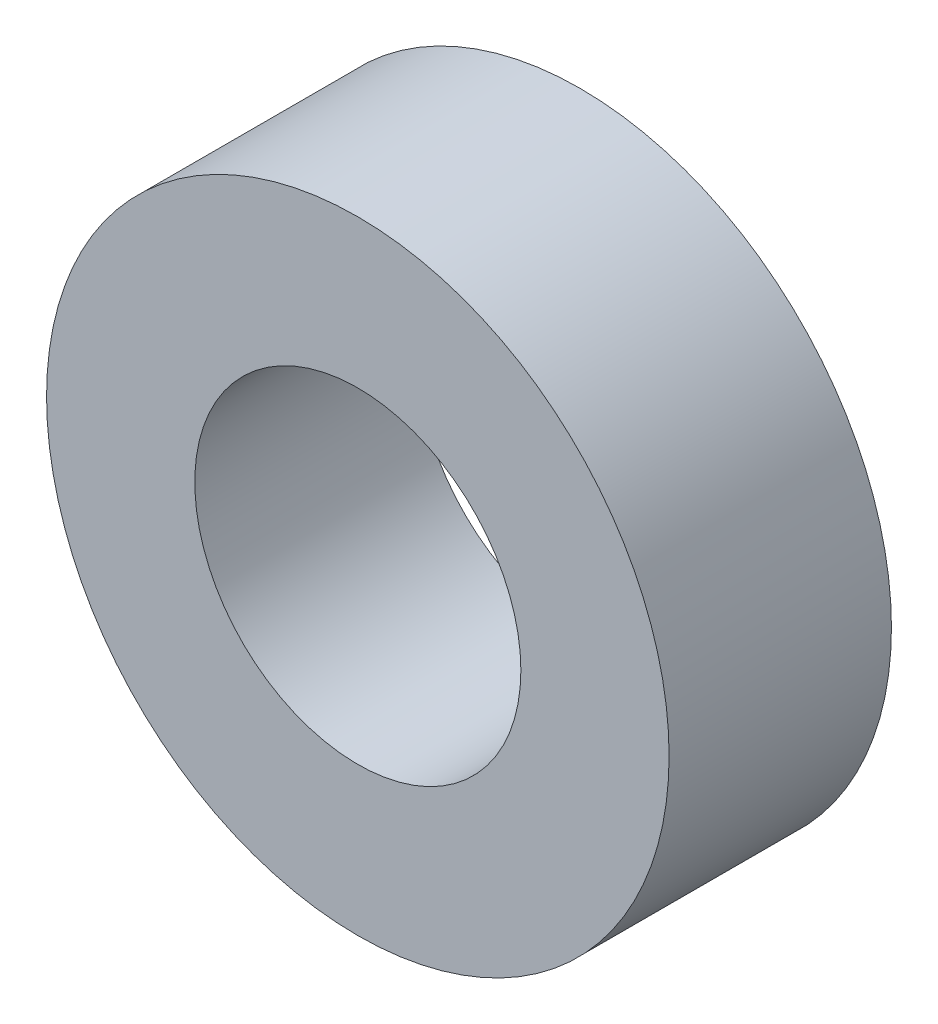
ISO-10303-21;
HEADER;
FILE_DESCRIPTION(('STEP AP214'),'2;1');
FILE_NAME('part.step','',(''),(''),'','','');
FILE_SCHEMA(('AUTOMOTIVE_DESIGN { 1 0 10303 214 1 1 1 1 }'));
ENDSEC;
DATA;
#1=APPLICATION_CONTEXT('core data for automotive mechanical design processes');
#2=APPLICATION_PROTOCOL_DEFINITION('international standard','automotive_design',2000,#1);
#3=PRODUCT_CONTEXT('',#1,'mechanical');
#4=PRODUCT('Part','Part','',(#3));
#5=PRODUCT_RELATED_PRODUCT_CATEGORY('part','',(#4));
#6=PRODUCT_DEFINITION_FORMATION('','',#4);
#7=PRODUCT_DEFINITION_CONTEXT('part definition',#1,'design');
#8=PRODUCT_DEFINITION('design','',#6,#7);
#9=PRODUCT_DEFINITION_SHAPE('','',#8);
#10=(LENGTH_UNIT() NAMED_UNIT(*) SI_UNIT(.MILLI.,.METRE.));
#11=(NAMED_UNIT(*) PLANE_ANGLE_UNIT() SI_UNIT($,.RADIAN.));
#12=(NAMED_UNIT(*) SI_UNIT($,.STERADIAN.) SOLID_ANGLE_UNIT());
#13=UNCERTAINTY_MEASURE_WITH_UNIT(LENGTH_MEASURE(1.E-05),#10,'distance_accuracy_value','');
#14=(GEOMETRIC_REPRESENTATION_CONTEXT(3) GLOBAL_UNCERTAINTY_ASSIGNED_CONTEXT((#13)) GLOBAL_UNIT_ASSIGNED_CONTEXT((#10,
#11,#12)) REPRESENTATION_CONTEXT('',''));
#15=CARTESIAN_POINT('',(0.,0.,0.));
#16=DIRECTION('',(0.,0.,1.));
#17=DIRECTION('',(1.,0.,0.));
#18=AXIS2_PLACEMENT_3D('',#15,#16,#17);
#19=CARTESIAN_POINT('',(0.,0.,1.5));
#20=DIRECTION('',(0.,0.,1.));
#21=DIRECTION('',(1.,0.,0.));
#22=AXIS2_PLACEMENT_3D('',#19,#20,#21);
#23=PLANE('',#22);
#24=CARTESIAN_POINT('',(0.,0.,1.5));
#25=DIRECTION('',(0.,0.,1.));
#26=DIRECTION('',(1.,0.,0.));
#27=AXIS2_PLACEMENT_3D('',#24,#25,#26);
#28=CIRCLE('',#27,2.1);
#29=CARTESIAN_POINT('',(2.1,0.,1.5));
#30=VERTEX_POINT('',#29);
#31=EDGE_CURVE('E10',#30,#30,#28,.T.);
#32=ORIENTED_EDGE('',*,*,#31,.T.);
#33=EDGE_LOOP('',(#32));
#34=FACE_BOUND('',#33,.T.);
#35=CARTESIAN_POINT('',(0.,0.,1.5));
#36=DIRECTION('',(0.,0.,1.));
#37=DIRECTION('',(1.,0.,0.));
#38=AXIS2_PLACEMENT_3D('',#35,#36,#37);
#39=CIRCLE('',#38,1.1);
#40=CARTESIAN_POINT('',(1.1,0.,1.5));
#41=VERTEX_POINT('',#40);
#42=EDGE_CURVE('E48',#41,#41,#39,.T.);
#43=ORIENTED_EDGE('',*,*,#42,.F.);
#44=EDGE_LOOP('',(#43));
#45=FACE_BOUND('',#44,.T.);
#46=ADVANCED_FACE('F37',(#34,#45),#23,.T.);
#47=CARTESIAN_POINT('',(0.,0.,0.));
#48=DIRECTION('',(0.,0.,1.));
#49=DIRECTION('',(1.,0.,0.));
#50=AXIS2_PLACEMENT_3D('',#47,#48,#49);
#51=PLANE('',#50);
#52=CARTESIAN_POINT('',(0.,0.,0.));
#53=DIRECTION('',(0.,0.,1.));
#54=DIRECTION('',(1.,0.,0.));
#55=AXIS2_PLACEMENT_3D('',#52,#53,#54);
#56=CIRCLE('',#55,2.1);
#57=CARTESIAN_POINT('',(2.1,0.,0.));
#58=VERTEX_POINT('',#57);
#59=EDGE_CURVE('E41',#58,#58,#56,.T.);
#60=ORIENTED_EDGE('',*,*,#59,.F.);
#61=EDGE_LOOP('',(#60));
#62=FACE_BOUND('',#61,.T.);
#63=CARTESIAN_POINT('',(0.,0.,0.));
#64=DIRECTION('',(0.,0.,1.));
#65=DIRECTION('',(1.,0.,0.));
#66=AXIS2_PLACEMENT_3D('',#63,#64,#65);
#67=CIRCLE('',#66,1.1);
#68=CARTESIAN_POINT('',(1.1,0.,0.));
#69=VERTEX_POINT('',#68);
#70=EDGE_CURVE('E50',#69,#69,#67,.T.);
#71=ORIENTED_EDGE('',*,*,#70,.T.);
#72=EDGE_LOOP('',(#71));
#73=FACE_BOUND('',#72,.T.);
#74=ADVANCED_FACE('F60',(#62,#73),#51,.F.);
#75=CARTESIAN_POINT('',(0.,0.,1.5));
#76=DIRECTION('',(0.,0.,-1.));
#77=DIRECTION('',(-1.,0.,0.));
#78=AXIS2_PLACEMENT_3D('',#75,#76,#77);
#79=CYLINDRICAL_SURFACE('',#78,2.1);
#80=ORIENTED_EDGE('',*,*,#31,.F.);
#81=EDGE_LOOP('',(#80));
#82=FACE_BOUND('',#81,.T.);
#83=ORIENTED_EDGE('',*,*,#59,.T.);
#84=EDGE_LOOP('',(#83));
#85=FACE_BOUND('',#84,.T.);
#86=ADVANCED_FACE('F39',(#82,#85),#79,.T.);
#87=CARTESIAN_POINT('',(0.,0.,1.5));
#88=DIRECTION('',(0.,0.,-1.));
#89=DIRECTION('',(-1.,0.,0.));
#90=AXIS2_PLACEMENT_3D('',#87,#88,#89);
#91=CYLINDRICAL_SURFACE('',#90,1.1);
#92=ORIENTED_EDGE('',*,*,#42,.T.);
#93=EDGE_LOOP('',(#92));
#94=FACE_BOUND('',#93,.T.);
#95=ORIENTED_EDGE('',*,*,#70,.F.);
#96=EDGE_LOOP('',(#95));
#97=FACE_BOUND('',#96,.T.);
#98=ADVANCED_FACE('F56',(#94,#97),#91,.F.);
#99=CLOSED_SHELL('',(#46,#74,#86,#98));
#100=MANIFOLD_SOLID_BREP('B2',#99);
#101=ADVANCED_BREP_SHAPE_REPRESENTATION('',(#18,#100),#14);
#102=SHAPE_DEFINITION_REPRESENTATION(#9,#101);
ENDSEC;
END-ISO-10303-21;
